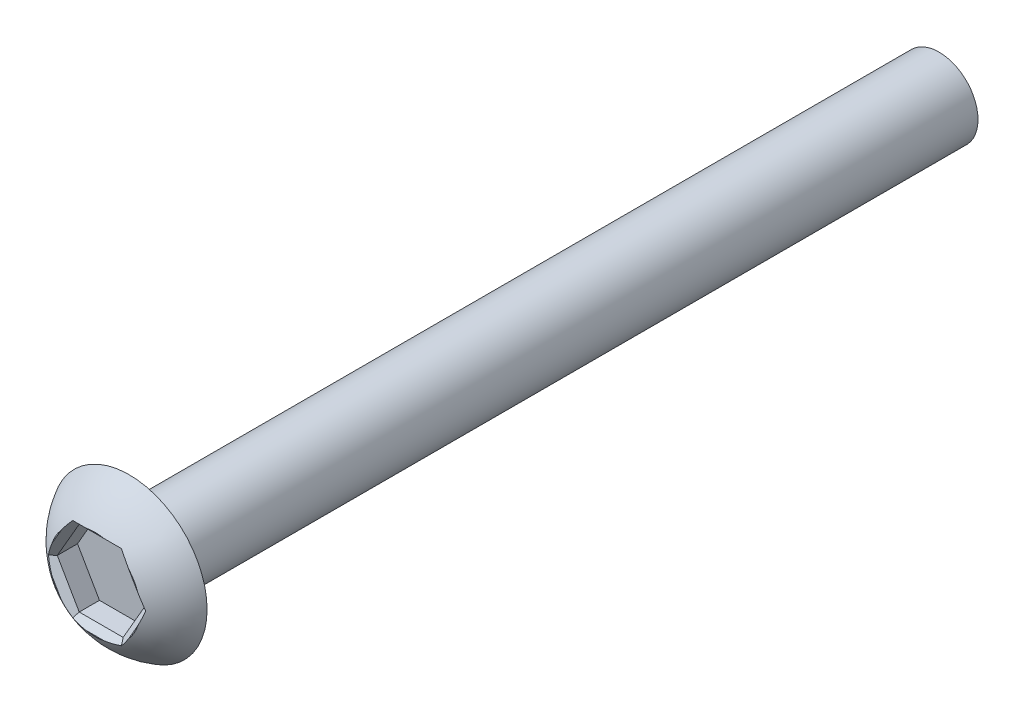
ISO-10303-21;
HEADER;
FILE_DESCRIPTION(('STEP AP214'),'2;1');
FILE_NAME('part.step','',(''),(''),'','','');
FILE_SCHEMA(('AUTOMOTIVE_DESIGN { 1 0 10303 214 1 1 1 1 }'));
ENDSEC;
DATA;
#1=APPLICATION_CONTEXT('core data for automotive mechanical design processes');
#2=APPLICATION_PROTOCOL_DEFINITION('international standard','automotive_design',2000,#1);
#3=PRODUCT_CONTEXT('',#1,'mechanical');
#4=PRODUCT('Part','Part','',(#3));
#5=PRODUCT_RELATED_PRODUCT_CATEGORY('part','',(#4));
#6=PRODUCT_DEFINITION_FORMATION('','',#4);
#7=PRODUCT_DEFINITION_CONTEXT('part definition',#1,'design');
#8=PRODUCT_DEFINITION('design','',#6,#7);
#9=PRODUCT_DEFINITION_SHAPE('','',#8);
#10=(LENGTH_UNIT() NAMED_UNIT(*) SI_UNIT(.MILLI.,.METRE.));
#11=(NAMED_UNIT(*) PLANE_ANGLE_UNIT() SI_UNIT($,.RADIAN.));
#12=(NAMED_UNIT(*) SI_UNIT($,.STERADIAN.) SOLID_ANGLE_UNIT());
#13=UNCERTAINTY_MEASURE_WITH_UNIT(LENGTH_MEASURE(1.E-05),#10,'distance_accuracy_value','');
#14=(GEOMETRIC_REPRESENTATION_CONTEXT(3) GLOBAL_UNCERTAINTY_ASSIGNED_CONTEXT((#13)) GLOBAL_UNIT_ASSIGNED_CONTEXT((#10,
#11,#12)) REPRESENTATION_CONTEXT('',''));
#15=CARTESIAN_POINT('',(0.,0.,0.));
#16=DIRECTION('',(0.,0.,1.));
#17=DIRECTION('',(1.,0.,0.));
#18=AXIS2_PLACEMENT_3D('',#15,#16,#17);
#19=CARTESIAN_POINT('',(-2.5,2.39752736076255,1.1));
#20=DIRECTION('',(0.,0.,-1.));
#21=DIRECTION('',(0.,1.,0.));
#22=AXIS2_PLACEMENT_3D('',#19,#20,#21);
#23=PLANE('',#22);
#24=CARTESIAN_POINT('',(0.,0.,1.1));
#25=DIRECTION('',(0.,0.,-1.));
#26=DIRECTION('',(0.,1.,0.));
#27=AXIS2_PLACEMENT_3D('',#24,#25,#26);
#28=CIRCLE('',#27,1.45143607047182);
#29=CARTESIAN_POINT('',(1.378444499704,0.45448589406322,1.1));
#30=VERTEX_POINT('',#29);
#31=CARTESIAN_POINT('',(1.08281857977244,0.966525007418976,1.1));
#32=VERTEX_POINT('',#31);
#33=EDGE_CURVE('E300',#30,#32,#28,.F.);
#34=ORIENTED_EDGE('',*,*,#33,.T.);
#35=DIRECTION('',(0.499999999999995,-0.866025403784442,0.));
#36=VECTOR('',#35,1.);
#37=CARTESIAN_POINT('',(1.58310702606533,0.100000000000001,1.1));
#38=LINE('',#37,#36);
#39=EDGE_CURVE('E218',#32,#30,#38,.T.);
#40=ORIENTED_EDGE('',*,*,#39,.T.);
#41=EDGE_LOOP('',(#34,#40));
#42=FACE_BOUND('',#41,.T.);
#43=ADVANCED_FACE('F45',(#42),#23,.F.);
#44=CARTESIAN_POINT('',(1.08281857977242,-0.966525007419,1.1));
#45=VERTEX_POINT('',#44);
#46=CARTESIAN_POINT('',(1.37844449970401,-0.454485894063208,1.1));
#47=VERTEX_POINT('',#46);
#48=EDGE_CURVE('E307',#45,#47,#28,.F.);
#49=ORIENTED_EDGE('',*,*,#48,.T.);
#50=DIRECTION('',(-0.500000000000001,-0.866025403784438,0.));
#51=VECTOR('',#50,1.);
#52=CARTESIAN_POINT('',(0.878156053411105,-1.32101090148221,1.1));
#53=LINE('',#52,#51);
#54=EDGE_CURVE('E215',#47,#45,#53,.T.);
#55=ORIENTED_EDGE('',*,*,#54,.T.);
#56=EDGE_LOOP('',(#49,#55));
#57=FACE_BOUND('',#56,.T.);
#58=ADVANCED_FACE('F330',(#57),#23,.F.);
#59=CARTESIAN_POINT('',(-0.295625919931594,-1.4210109014822,1.1));
#60=VERTEX_POINT('',#59);
#61=CARTESIAN_POINT('',(0.295625919931584,-1.42101090148221,1.1));
#62=VERTEX_POINT('',#61);
#63=EDGE_CURVE('E316',#60,#62,#28,.F.);
#64=ORIENTED_EDGE('',*,*,#63,.T.);
#65=DIRECTION('',(-1.,0.,0.));
#66=VECTOR('',#65,1.);
#67=CARTESIAN_POINT('',(-0.704950972654223,-1.4210109014822,1.1));
#68=LINE('',#67,#66);
#69=EDGE_CURVE('E212',#62,#60,#68,.T.);
#70=ORIENTED_EDGE('',*,*,#69,.T.);
#71=EDGE_LOOP('',(#64,#70));
#72=FACE_BOUND('',#71,.T.);
#73=ADVANCED_FACE('F343',(#72),#23,.F.);
#74=CARTESIAN_POINT('',(-1.37844449970401,-0.454485894063192,1.1));
#75=VERTEX_POINT('',#74);
#76=CARTESIAN_POINT('',(-1.08281857977243,-0.966525007418998,1.1));
#77=VERTEX_POINT('',#76);
#78=EDGE_CURVE('E310',#75,#77,#28,.F.);
#79=ORIENTED_EDGE('',*,*,#78,.T.);
#80=DIRECTION('',(-0.499999999999995,0.866025403784442,0.));
#81=VECTOR('',#80,1.);
#82=CARTESIAN_POINT('',(-1.58310702606532,-0.0999999999999906,1.1));
#83=LINE('',#82,#81);
#84=EDGE_CURVE('E209',#77,#75,#83,.T.);
#85=ORIENTED_EDGE('',*,*,#84,.T.);
#86=EDGE_LOOP('',(#79,#85));
#87=FACE_BOUND('',#86,.T.);
#88=ADVANCED_FACE('F348',(#87),#23,.F.);
#89=CARTESIAN_POINT('',(0.295625919931603,1.4210109014822,1.1));
#90=VERTEX_POINT('',#89);
#91=CARTESIAN_POINT('',(-0.295625919931574,1.42101090148221,1.1));
#92=VERTEX_POINT('',#91);
#93=EDGE_CURVE('E294',#90,#92,#28,.F.);
#94=ORIENTED_EDGE('',*,*,#93,.T.);
#95=DIRECTION('',(1.,0.,0.));
#96=VECTOR('',#95,1.);
#97=CARTESIAN_POINT('',(0.704950972654233,1.4210109014822,1.1));
#98=LINE('',#97,#96);
#99=EDGE_CURVE('E206',#92,#90,#98,.T.);
#100=ORIENTED_EDGE('',*,*,#99,.T.);
#101=EDGE_LOOP('',(#94,#100));
#102=FACE_BOUND('',#101,.T.);
#103=ADVANCED_FACE('F358',(#102),#23,.F.);
#104=CARTESIAN_POINT('',(0.,0.,-1.33333333333333));
#105=DIRECTION('',(0.,0.,1.));
#106=DIRECTION('',(0.,-1.,0.));
#107=AXIS2_PLACEMENT_3D('',#104,#105,#106);
#108=SPHERICAL_SURFACE('',#107,2.83333333333333);
#109=ORIENTED_EDGE('',*,*,#33,.F.);
#110=CARTESIAN_POINT('',(-0.438348471401963,-0.253080607962781,-0.827172117407764));
#111=DIRECTION('',(-0.612372435695795,-0.353553390593269,0.70710678118655));
#112=DIRECTION('',(0.755928946018455,0.,0.654653670707976));
#113=AXIS2_PLACEMENT_3D('',#110,#111,#112);
#114=CIRCLE('',#113,2.74141923549888);
#115=CARTESIAN_POINT('',(1.56123159166266,0.,1.03105531808848));
#116=VERTEX_POINT('',#115);
#117=EDGE_CURVE('E255',#30,#116,#114,.F.);
#118=ORIENTED_EDGE('',*,*,#117,.T.);
#119=CARTESIAN_POINT('',(-0.438348471401965,0.253080607962786,-0.827172117407759));
#120=DIRECTION('',(-0.612372435695791,0.353553390593273,0.707106781186551));
#121=DIRECTION('',(0.755928946018458,0.,0.654653670707973));
#122=AXIS2_PLACEMENT_3D('',#119,#120,#121);
#123=CIRCLE('',#122,2.74141923549888);
#124=EDGE_CURVE('E252',#116,#47,#123,.F.);
#125=ORIENTED_EDGE('',*,*,#124,.T.);
#126=ORIENTED_EDGE('',*,*,#48,.F.);
#127=CARTESIAN_POINT('',(-0.438348471401965,0.253080607962786,-0.827172117407759));
#128=DIRECTION('',(-0.612372435695791,0.353553390593273,0.707106781186551));
#129=DIRECTION('',(0.755928946018458,0.,0.654653670707973));
#130=AXIS2_PLACEMENT_3D('',#127,#128,#129);
#131=CIRCLE('',#130,2.74141923549888);
#132=CARTESIAN_POINT('',(0.780615795831329,-1.35206621957068,1.03105531808848));
#133=VERTEX_POINT('',#132);
#134=EDGE_CURVE('E249',#45,#133,#131,.F.);
#135=ORIENTED_EDGE('',*,*,#134,.T.);
#136=CARTESIAN_POINT('',(0.,0.506161215925569,-0.827172117407763));
#137=DIRECTION('',(0.,0.707106781186545,0.70710678118655));
#138=DIRECTION('',(0.,-0.70710678118655,0.707106781186545));
#139=AXIS2_PLACEMENT_3D('',#136,#137,#138);
#140=CIRCLE('',#139,2.74141923549888);
#141=EDGE_CURVE('E246',#133,#62,#140,.F.);
#142=ORIENTED_EDGE('',*,*,#141,.T.);
#143=ORIENTED_EDGE('',*,*,#63,.F.);
#144=CARTESIAN_POINT('',(0.,0.506161215925569,-0.827172117407763));
#145=DIRECTION('',(0.,0.707106781186545,0.70710678118655));
#146=DIRECTION('',(0.,-0.70710678118655,0.707106781186545));
#147=AXIS2_PLACEMENT_3D('',#144,#145,#146);
#148=CIRCLE('',#147,2.74141923549888);
#149=CARTESIAN_POINT('',(-0.780615795831338,-1.35206621957068,1.03105531808848));
#150=VERTEX_POINT('',#149);
#151=EDGE_CURVE('E243',#60,#150,#148,.F.);
#152=ORIENTED_EDGE('',*,*,#151,.T.);
#153=CARTESIAN_POINT('',(0.438348471401965,0.253080607962782,-0.827172117407763));
#154=DIRECTION('',(0.612372435695795,0.353553390593269,0.707106781186549));
#155=DIRECTION('',(0.755928946018455,0.,-0.654653670707977));
#156=AXIS2_PLACEMENT_3D('',#153,#154,#155);
#157=CIRCLE('',#156,2.74141923549888);
#158=EDGE_CURVE('E240',#150,#77,#157,.F.);
#159=ORIENTED_EDGE('',*,*,#158,.T.);
#160=ORIENTED_EDGE('',*,*,#78,.F.);
#161=CARTESIAN_POINT('',(0.438348471401965,0.253080607962782,-0.827172117407763));
#162=DIRECTION('',(0.612372435695795,0.353553390593269,0.707106781186549));
#163=DIRECTION('',(0.755928946018455,0.,-0.654653670707977));
#164=AXIS2_PLACEMENT_3D('',#161,#162,#163);
#165=CIRCLE('',#164,2.74141923549888);
#166=CARTESIAN_POINT('',(-1.56123159166266,0.,1.03105531808848));
#167=VERTEX_POINT('',#166);
#168=EDGE_CURVE('E225',#75,#167,#165,.F.);
#169=ORIENTED_EDGE('',*,*,#168,.T.);
#170=CARTESIAN_POINT('',(0.438348471401962,-0.253080607962788,-0.827172117407761));
#171=DIRECTION('',(0.61237243569579,-0.353553390593277,0.70710678118655));
#172=DIRECTION('',(0.755928946018458,0.,-0.654653670707973));
#173=AXIS2_PLACEMENT_3D('',#170,#171,#172);
#174=CIRCLE('',#173,2.74141923549888);
#175=CARTESIAN_POINT('',(-1.37844449970401,0.454485894063214,1.1));
#176=VERTEX_POINT('',#175);
#177=EDGE_CURVE('E222',#167,#176,#174,.F.);
#178=ORIENTED_EDGE('',*,*,#177,.T.);
#179=CARTESIAN_POINT('',(-1.08281857977241,0.966525007419011,1.1));
#180=VERTEX_POINT('',#179);
#181=EDGE_CURVE('E178',#180,#176,#28,.F.);
#182=ORIENTED_EDGE('',*,*,#181,.F.);
#183=CARTESIAN_POINT('',(0.438348471401962,-0.253080607962788,-0.827172117407761));
#184=DIRECTION('',(0.61237243569579,-0.353553390593277,0.70710678118655));
#185=DIRECTION('',(0.755928946018458,0.,-0.654653670707973));
#186=AXIS2_PLACEMENT_3D('',#183,#184,#185);
#187=CIRCLE('',#186,2.74141923549888);
#188=CARTESIAN_POINT('',(-0.78061579583132,1.35206621957069,1.03105531808848));
#189=VERTEX_POINT('',#188);
#190=EDGE_CURVE('E228',#180,#189,#187,.F.);
#191=ORIENTED_EDGE('',*,*,#190,.T.);
#192=CARTESIAN_POINT('',(0.,-0.506161215925569,-0.827172117407762));
#193=DIRECTION('',(0.,-0.707106781186545,0.707106781186549));
#194=DIRECTION('',(0.,-0.70710678118655,-0.707106781186546));
#195=AXIS2_PLACEMENT_3D('',#192,#193,#194);
#196=CIRCLE('',#195,2.74141923549888);
#197=EDGE_CURVE('E231',#189,#92,#196,.F.);
#198=ORIENTED_EDGE('',*,*,#197,.T.);
#199=ORIENTED_EDGE('',*,*,#93,.F.);
#200=CARTESIAN_POINT('',(0.,-0.506161215925569,-0.827172117407762));
#201=DIRECTION('',(0.,-0.707106781186545,0.707106781186549));
#202=DIRECTION('',(0.,-0.70710678118655,-0.707106781186546));
#203=AXIS2_PLACEMENT_3D('',#200,#201,#202);
#204=CIRCLE('',#203,2.74141923549888);
#205=CARTESIAN_POINT('',(0.780615795831348,1.35206621957067,1.03105531808848));
#206=VERTEX_POINT('',#205);
#207=EDGE_CURVE('E234',#90,#206,#204,.F.);
#208=ORIENTED_EDGE('',*,*,#207,.T.);
#209=CARTESIAN_POINT('',(-0.438348471401963,-0.253080607962781,-0.827172117407764));
#210=DIRECTION('',(-0.612372435695795,-0.353553390593269,0.70710678118655));
#211=DIRECTION('',(0.755928946018455,0.,0.654653670707976));
#212=AXIS2_PLACEMENT_3D('',#209,#210,#211);
#213=CIRCLE('',#212,2.74141923549888);
#214=EDGE_CURVE('E237',#206,#32,#213,.F.);
#215=ORIENTED_EDGE('',*,*,#214,.T.);
#216=EDGE_LOOP('',(#109,#118,#125,#126,#135,#142,#143,#152,#159,#160,#169,#178,#182,#191,#198,
#199,#208,#215));
#217=FACE_BOUND('',#216,.T.);
#218=CARTESIAN_POINT('',(0.,0.,0.));
#219=DIRECTION('',(0.,0.,1.));
#220=DIRECTION('',(1.,0.,0.));
#221=AXIS2_PLACEMENT_3D('',#218,#219,#220);
#222=CIRCLE('',#221,2.5);
#223=CARTESIAN_POINT('',(2.5,0.,0.));
#224=VERTEX_POINT('',#223);
#225=EDGE_CURVE('E184',#224,#224,#222,.T.);
#226=ORIENTED_EDGE('',*,*,#225,.T.);
#227=EDGE_LOOP('',(#226));
#228=FACE_BOUND('',#227,.T.);
#229=ADVANCED_FACE('F340',(#217,#228),#108,.T.);
#230=CARTESIAN_POINT('',(0.,0.,-26.));
#231=DIRECTION('',(0.,0.,1.));
#232=DIRECTION('',(1.,0.,0.));
#233=AXIS2_PLACEMENT_3D('',#230,#231,#232);
#234=CYLINDRICAL_SURFACE('',#233,1.25);
#235=CARTESIAN_POINT('',(0.,0.,-26.));
#236=DIRECTION('',(0.,0.,1.));
#237=DIRECTION('',(1.,0.,0.));
#238=AXIS2_PLACEMENT_3D('',#235,#236,#237);
#239=CIRCLE('',#238,1.25);
#240=CARTESIAN_POINT('',(1.25,0.,-26.));
#241=VERTEX_POINT('',#240);
#242=EDGE_CURVE('E196',#241,#241,#239,.T.);
#243=CARTESIAN_POINT('',(0.,0.,0.));
#244=DIRECTION('',(0.,0.,1.));
#245=DIRECTION('',(1.,0.,0.));
#246=AXIS2_PLACEMENT_3D('',#243,#244,#245);
#247=CIRCLE('',#246,1.25);
#248=CARTESIAN_POINT('',(1.25,0.,0.));
#249=VERTEX_POINT('',#248);
#250=EDGE_CURVE('E190',#249,#249,#247,.T.);
#251=CARTESIAN_POINT('',(1.25,0.,-26.));
#252=CARTESIAN_POINT('',(1.25,0.,-25.7291666666667));
#253=CARTESIAN_POINT('',(1.25,0.,-25.4583333333333));
#254=CARTESIAN_POINT('',(1.25,0.,-24.9166666666667));
#255=CARTESIAN_POINT('',(1.25,0.,-24.6458333333333));
#256=CARTESIAN_POINT('',(1.25,0.,-24.1041666666667));
#257=CARTESIAN_POINT('',(1.25,0.,-23.8333333333333));
#258=CARTESIAN_POINT('',(1.25,0.,-23.2916666666667));
#259=CARTESIAN_POINT('',(1.25,0.,-23.0208333333333));
#260=CARTESIAN_POINT('',(1.25,0.,-22.4791666666667));
#261=CARTESIAN_POINT('',(1.25,0.,-22.2083333333333));
#262=CARTESIAN_POINT('',(1.25,0.,-21.6666666666667));
#263=CARTESIAN_POINT('',(1.25,0.,-21.3958333333333));
#264=CARTESIAN_POINT('',(1.25,0.,-20.8541666666667));
#265=CARTESIAN_POINT('',(1.25,0.,-20.5833333333333));
#266=CARTESIAN_POINT('',(1.25,0.,-20.0416666666667));
#267=CARTESIAN_POINT('',(1.25,0.,-19.7708333333333));
#268=CARTESIAN_POINT('',(1.25,0.,-19.2291666666667));
#269=CARTESIAN_POINT('',(1.25,0.,-18.9583333333333));
#270=CARTESIAN_POINT('',(1.25,0.,-18.4166666666667));
#271=CARTESIAN_POINT('',(1.25,0.,-18.1458333333333));
#272=CARTESIAN_POINT('',(1.25,0.,-17.6041666666667));
#273=CARTESIAN_POINT('',(1.25,0.,-17.3333333333333));
#274=CARTESIAN_POINT('',(1.25,0.,-16.7916666666667));
#275=CARTESIAN_POINT('',(1.25,0.,-16.5208333333333));
#276=CARTESIAN_POINT('',(1.25,0.,-15.9791666666667));
#277=CARTESIAN_POINT('',(1.25,0.,-15.7083333333333));
#278=CARTESIAN_POINT('',(1.25,0.,-15.1666666666667));
#279=CARTESIAN_POINT('',(1.25,0.,-14.8958333333333));
#280=CARTESIAN_POINT('',(1.25,0.,-14.3541666666667));
#281=CARTESIAN_POINT('',(1.25,0.,-14.0833333333333));
#282=CARTESIAN_POINT('',(1.25,0.,-13.5416666666667));
#283=CARTESIAN_POINT('',(1.25,0.,-13.2708333333333));
#284=CARTESIAN_POINT('',(1.25,0.,-12.7291666666667));
#285=CARTESIAN_POINT('',(1.25,0.,-12.4583333333333));
#286=CARTESIAN_POINT('',(1.25,0.,-11.9166666666667));
#287=CARTESIAN_POINT('',(1.25,0.,-11.6458333333333));
#288=CARTESIAN_POINT('',(1.25,0.,-11.1041666666667));
#289=CARTESIAN_POINT('',(1.25,0.,-10.8333333333333));
#290=CARTESIAN_POINT('',(1.25,0.,-10.2916666666667));
#291=CARTESIAN_POINT('',(1.25,0.,-10.0208333333333));
#292=CARTESIAN_POINT('',(1.25,0.,-9.47916666666667));
#293=CARTESIAN_POINT('',(1.25,0.,-9.20833333333333));
#294=CARTESIAN_POINT('',(1.25,0.,-8.66666666666667));
#295=CARTESIAN_POINT('',(1.25,0.,-8.39583333333333));
#296=CARTESIAN_POINT('',(1.25,0.,-7.85416666666667));
#297=CARTESIAN_POINT('',(1.25,0.,-7.58333333333333));
#298=CARTESIAN_POINT('',(1.25,0.,-7.04166666666667));
#299=CARTESIAN_POINT('',(1.25,0.,-6.77083333333333));
#300=CARTESIAN_POINT('',(1.25,0.,-6.22916666666667));
#301=CARTESIAN_POINT('',(1.25,0.,-5.95833333333333));
#302=CARTESIAN_POINT('',(1.25,0.,-5.41666666666667));
#303=CARTESIAN_POINT('',(1.25,0.,-5.14583333333333));
#304=CARTESIAN_POINT('',(1.25,0.,-4.60416666666667));
#305=CARTESIAN_POINT('',(1.25,0.,-4.33333333333333));
#306=CARTESIAN_POINT('',(1.25,0.,-3.79166666666667));
#307=CARTESIAN_POINT('',(1.25,0.,-3.52083333333333));
#308=CARTESIAN_POINT('',(1.25,0.,-2.97916666666667));
#309=CARTESIAN_POINT('',(1.25,0.,-2.70833333333333));
#310=CARTESIAN_POINT('',(1.25,0.,-2.16666666666667));
#311=CARTESIAN_POINT('',(1.25,0.,-1.89583333333333));
#312=CARTESIAN_POINT('',(1.25,0.,-1.35416666666667));
#313=CARTESIAN_POINT('',(1.25,0.,-1.08333333333333));
#314=CARTESIAN_POINT('',(1.25,0.,-0.541666666666667));
#315=CARTESIAN_POINT('',(1.25,0.,-0.270833333333334));
#316=CARTESIAN_POINT('',(1.25,0.,0.));
#317=B_SPLINE_CURVE_WITH_KNOTS('',3,(#251,#252,#253,#254,#255,#256,#257,#258,#259,#260,#261,
#262,#263,#264,#265,#266,#267,#268,#269,#270,#271,#272,#273,#274,#275,#276,#277,#278,#279,#280,
#281,#282,#283,#284,#285,#286,#287,#288,#289,#290,#291,#292,#293,#294,#295,#296,#297,#298,#299,
#300,#301,#302,#303,#304,#305,#306,#307,#308,#309,#310,#311,#312,#313,#314,#315,#316),
.UNSPECIFIED.,.F.,.F.,(4,2,2,2,2,2,2,2,2,2,2,2,2,2,2,2,2,2,2,2,2,2,2,2,2,2,2,2,2,2,2,2,4),(0.,
0.812499999999997,1.625,2.4375,3.25,4.0625,4.875,5.6875,6.5,7.3125,8.125,8.9375,9.75,10.5625,
11.375,12.1875,13.,13.8125,14.625,15.4375,16.25,17.0625,17.875,18.6875,19.5,20.3125,21.125,
21.9375,22.75,23.5625,24.375,25.1875,26.),.UNSPECIFIED.);
#318=EDGE_CURVE('BSEAM385',#241,#249,#317,.T.);
#319=ORIENTED_EDGE('',*,*,#242,.T.);
#320=ORIENTED_EDGE('',*,*,#250,.F.);
#321=ORIENTED_EDGE('',*,*,#318,.T.);
#322=ORIENTED_EDGE('',*,*,#318,.F.);
#323=EDGE_LOOP('',(#319,#321,#320,#322));
#324=FACE_BOUND('',#323,.T.);
#325=ADVANCED_FACE('F385',(#324),#234,.T.);
#326=CARTESIAN_POINT('',(0.,0.,-26.));
#327=DIRECTION('',(0.,0.,1.));
#328=DIRECTION('',(1.,0.,0.));
#329=AXIS2_PLACEMENT_3D('',#326,#327,#328);
#330=PLANE('',#329);
#331=ORIENTED_EDGE('',*,*,#242,.F.);
#332=EDGE_LOOP('',(#331));
#333=FACE_BOUND('',#332,.T.);
#334=ADVANCED_FACE('F377',(#333),#330,.F.);
#335=CARTESIAN_POINT('',(0.,0.,0.));
#336=DIRECTION('',(0.,0.,1.));
#337=DIRECTION('',(1.,0.,0.));
#338=AXIS2_PLACEMENT_3D('',#335,#336,#337);
#339=PLANE('',#338);
#340=ORIENTED_EDGE('',*,*,#250,.T.);
#341=EDGE_LOOP('',(#340));
#342=FACE_BOUND('',#341,.T.);
#343=ORIENTED_EDGE('',*,*,#225,.F.);
#344=EDGE_LOOP('',(#343));
#345=FACE_BOUND('',#344,.T.);
#346=ADVANCED_FACE('F371',(#342,#345),#339,.F.);
#347=ORIENTED_EDGE('',*,*,#181,.T.);
#348=DIRECTION('',(0.500000000000007,0.866025403784435,0.));
#349=VECTOR('',#348,1.);
#350=CARTESIAN_POINT('',(-0.878156053411096,1.32101090148221,1.1));
#351=LINE('',#350,#349);
#352=EDGE_CURVE('E200',#176,#180,#351,.T.);
#353=ORIENTED_EDGE('',*,*,#352,.T.);
#354=EDGE_LOOP('',(#347,#353));
#355=FACE_BOUND('',#354,.T.);
#356=ADVANCED_FACE('F352',(#355),#23,.F.);
#357=CARTESIAN_POINT('',(0.,0.,0.25));
#358=DIRECTION('',(0.,0.,-1.));
#359=DIRECTION('',(-1.,0.,0.));
#360=AXIS2_PLACEMENT_3D('',#357,#358,#359);
#361=PLANE('',#360);
#362=DIRECTION('',(0.499999999999995,-0.866025403784441,0.));
#363=VECTOR('',#362,1.);
#364=CARTESIAN_POINT('',(0.704950972654231,1.22101090148219,0.25));
#365=LINE('',#364,#363);
#366=CARTESIAN_POINT('',(0.704950972654231,1.22101090148219,0.25));
#367=VERTEX_POINT('',#366);
#368=CARTESIAN_POINT('',(1.40990194530843,0.,0.25));
#369=VERTEX_POINT('',#368);
#370=EDGE_CURVE('E160',#367,#369,#365,.T.);
#371=ORIENTED_EDGE('',*,*,#370,.F.);
#372=DIRECTION('',(1.,0.,0.));
#373=VECTOR('',#372,1.);
#374=CARTESIAN_POINT('',(-0.704950972654205,1.22101090148221,0.25));
#375=LINE('',#374,#373);
#376=CARTESIAN_POINT('',(-0.704950972654205,1.22101090148221,0.25));
#377=VERTEX_POINT('',#376);
#378=EDGE_CURVE('E574',#377,#367,#375,.T.);
#379=ORIENTED_EDGE('',*,*,#378,.F.);
#380=DIRECTION('',(0.500000000000007,0.866025403784434,0.));
#381=VECTOR('',#380,1.);
#382=CARTESIAN_POINT('',(-1.40990194530843,0.,0.25));
#383=LINE('',#382,#381);
#384=CARTESIAN_POINT('',(-1.40990194530843,0.,0.25));
#385=VERTEX_POINT('',#384);
#386=EDGE_CURVE('E577',#385,#377,#383,.T.);
#387=ORIENTED_EDGE('',*,*,#386,.F.);
#388=DIRECTION('',(-0.499999999999995,0.866025403784442,0.));
#389=VECTOR('',#388,1.);
#390=CARTESIAN_POINT('',(-0.704950972654223,-1.2210109014822,0.25));
#391=LINE('',#390,#389);
#392=CARTESIAN_POINT('',(-0.704950972654223,-1.2210109014822,0.25));
#393=VERTEX_POINT('',#392);
#394=EDGE_CURVE('E580',#393,#385,#391,.T.);
#395=ORIENTED_EDGE('',*,*,#394,.F.);
#396=DIRECTION('',(-1.,0.,0.));
#397=VECTOR('',#396,1.);
#398=CARTESIAN_POINT('',(0.704950972654214,-1.2210109014822,0.25));
#399=LINE('',#398,#397);
#400=CARTESIAN_POINT('',(0.704950972654214,-1.2210109014822,0.25));
#401=VERTEX_POINT('',#400);
#402=EDGE_CURVE('E162',#401,#393,#399,.T.);
#403=ORIENTED_EDGE('',*,*,#402,.F.);
#404=DIRECTION('',(-0.500000000000001,-0.866025403784438,0.));
#405=VECTOR('',#404,1.);
#406=CARTESIAN_POINT('',(1.40990194530843,0.,0.25));
#407=LINE('',#406,#405);
#408=EDGE_CURVE('E156',#369,#401,#407,.T.);
#409=ORIENTED_EDGE('',*,*,#408,.F.);
#410=EDGE_LOOP('',(#371,#379,#387,#395,#403,#409));
#411=FACE_BOUND('',#410,.T.);
#412=ADVANCED_FACE('F158',(#411),#361,.F.);
#413=CARTESIAN_POINT('',(-0.704950972654205,1.22101090148221,0.25));
#414=DIRECTION('',(0.,-1.,0.));
#415=DIRECTION('',(1.,0.,0.));
#416=AXIS2_PLACEMENT_3D('',#413,#414,#415);
#417=PLANE('',#416);
#418=DIRECTION('',(0.,0.,1.));
#419=VECTOR('',#418,1.);
#420=CARTESIAN_POINT('',(0.704950972654231,1.22101090148219,0.25));
#421=LINE('',#420,#419);
#422=CARTESIAN_POINT('',(0.704950972654231,1.22101090148219,0.899999999999998));
#423=VERTEX_POINT('',#422);
#424=EDGE_CURVE('E176',#367,#423,#421,.T.);
#425=ORIENTED_EDGE('',*,*,#424,.T.);
#426=DIRECTION('',(-1.,0.,0.));
#427=VECTOR('',#426,1.);
#428=CARTESIAN_POINT('',(-0.704950972654205,1.22101090148221,0.899999999999998));
#429=LINE('',#428,#427);
#430=CARTESIAN_POINT('',(-0.704950972654205,1.22101090148221,0.899999999999998));
#431=VERTEX_POINT('',#430);
#432=EDGE_CURVE('E56',#423,#431,#429,.T.);
#433=ORIENTED_EDGE('',*,*,#432,.T.);
#434=DIRECTION('',(0.,0.,1.));
#435=VECTOR('',#434,1.);
#436=CARTESIAN_POINT('',(-0.704950972654205,1.22101090148221,0.25));
#437=LINE('',#436,#435);
#438=EDGE_CURVE('E567',#377,#431,#437,.T.);
#439=ORIENTED_EDGE('',*,*,#438,.F.);
#440=ORIENTED_EDGE('',*,*,#378,.T.);
#441=EDGE_LOOP('',(#425,#433,#439,#440));
#442=FACE_BOUND('',#441,.T.);
#443=ADVANCED_FACE('F376',(#442),#417,.T.);
#444=CARTESIAN_POINT('',(-1.40990194530843,0.,0.25));
#445=DIRECTION('',(0.866025403784435,-0.500000000000007,0.));
#446=DIRECTION('',(0.500000000000007,0.866025403784435,0.));
#447=AXIS2_PLACEMENT_3D('',#444,#445,#446);
#448=PLANE('',#447);
#449=ORIENTED_EDGE('',*,*,#438,.T.);
#450=DIRECTION('',(-0.500000000000007,-0.866025403784435,0.));
#451=VECTOR('',#450,1.);
#452=CARTESIAN_POINT('',(-1.40990194530843,0.,0.899999999999998));
#453=LINE('',#452,#451);
#454=CARTESIAN_POINT('',(-1.40990194530843,0.,0.899999999999998));
#455=VERTEX_POINT('',#454);
#456=EDGE_CURVE('E11',#431,#455,#453,.T.);
#457=ORIENTED_EDGE('',*,*,#456,.T.);
#458=DIRECTION('',(0.,0.,1.));
#459=VECTOR('',#458,1.);
#460=CARTESIAN_POINT('',(-1.40990194530843,0.,0.25));
#461=LINE('',#460,#459);
#462=EDGE_CURVE('E565',#385,#455,#461,.T.);
#463=ORIENTED_EDGE('',*,*,#462,.F.);
#464=ORIENTED_EDGE('',*,*,#386,.T.);
#465=EDGE_LOOP('',(#449,#457,#463,#464));
#466=FACE_BOUND('',#465,.T.);
#467=ADVANCED_FACE('F453',(#466),#448,.T.);
#468=CARTESIAN_POINT('',(-0.704950972654223,-1.2210109014822,0.25));
#469=DIRECTION('',(0.866025403784442,0.499999999999995,0.));
#470=DIRECTION('',(-0.499999999999995,0.866025403784442,0.));
#471=AXIS2_PLACEMENT_3D('',#468,#469,#470);
#472=PLANE('',#471);
#473=ORIENTED_EDGE('',*,*,#462,.T.);
#474=DIRECTION('',(0.499999999999995,-0.866025403784442,0.));
#475=VECTOR('',#474,1.);
#476=CARTESIAN_POINT('',(-0.704950972654223,-1.2210109014822,0.899999999999998));
#477=LINE('',#476,#475);
#478=CARTESIAN_POINT('',(-0.704950972654223,-1.2210109014822,0.899999999999998));
#479=VERTEX_POINT('',#478);
#480=EDGE_CURVE('E266',#455,#479,#477,.T.);
#481=ORIENTED_EDGE('',*,*,#480,.T.);
#482=DIRECTION('',(0.,0.,1.));
#483=VECTOR('',#482,1.);
#484=CARTESIAN_POINT('',(-0.704950972654223,-1.2210109014822,0.25));
#485=LINE('',#484,#483);
#486=EDGE_CURVE('E192',#393,#479,#485,.T.);
#487=ORIENTED_EDGE('',*,*,#486,.F.);
#488=ORIENTED_EDGE('',*,*,#394,.T.);
#489=EDGE_LOOP('',(#473,#481,#487,#488));
#490=FACE_BOUND('',#489,.T.);
#491=ADVANCED_FACE('F462',(#490),#472,.T.);
#492=CARTESIAN_POINT('',(0.704950972654214,-1.2210109014822,0.25));
#493=DIRECTION('',(0.,1.,0.));
#494=DIRECTION('',(-1.,0.,0.));
#495=AXIS2_PLACEMENT_3D('',#492,#493,#494);
#496=PLANE('',#495);
#497=ORIENTED_EDGE('',*,*,#486,.T.);
#498=DIRECTION('',(1.,0.,0.));
#499=VECTOR('',#498,1.);
#500=CARTESIAN_POINT('',(0.704950972654214,-1.2210109014822,0.899999999999998));
#501=LINE('',#500,#499);
#502=CARTESIAN_POINT('',(0.704950972654214,-1.2210109014822,0.899999999999998));
#503=VERTEX_POINT('',#502);
#504=EDGE_CURVE('E263',#479,#503,#501,.T.);
#505=ORIENTED_EDGE('',*,*,#504,.T.);
#506=DIRECTION('',(0.,0.,1.));
#507=VECTOR('',#506,1.);
#508=CARTESIAN_POINT('',(0.704950972654214,-1.2210109014822,0.25));
#509=LINE('',#508,#507);
#510=EDGE_CURVE('E185',#401,#503,#509,.T.);
#511=ORIENTED_EDGE('',*,*,#510,.F.);
#512=ORIENTED_EDGE('',*,*,#402,.T.);
#513=EDGE_LOOP('',(#497,#505,#511,#512));
#514=FACE_BOUND('',#513,.T.);
#515=ADVANCED_FACE('F471',(#514),#496,.T.);
#516=CARTESIAN_POINT('',(1.40990194530843,0.,0.25));
#517=DIRECTION('',(-0.866025403784438,0.500000000000001,0.));
#518=DIRECTION('',(-0.500000000000001,-0.866025403784438,0.));
#519=AXIS2_PLACEMENT_3D('',#516,#517,#518);
#520=PLANE('',#519);
#521=ORIENTED_EDGE('',*,*,#510,.T.);
#522=DIRECTION('',(0.500000000000001,0.866025403784438,0.));
#523=VECTOR('',#522,1.);
#524=CARTESIAN_POINT('',(1.40990194530843,0.,0.899999999999998));
#525=LINE('',#524,#523);
#526=CARTESIAN_POINT('',(1.40990194530843,0.,0.899999999999998));
#527=VERTEX_POINT('',#526);
#528=EDGE_CURVE('E182',#503,#527,#525,.T.);
#529=ORIENTED_EDGE('',*,*,#528,.T.);
#530=DIRECTION('',(0.,0.,1.));
#531=VECTOR('',#530,1.);
#532=CARTESIAN_POINT('',(1.40990194530843,0.,0.25));
#533=LINE('',#532,#531);
#534=EDGE_CURVE('E174',#369,#527,#533,.T.);
#535=ORIENTED_EDGE('',*,*,#534,.F.);
#536=ORIENTED_EDGE('',*,*,#408,.T.);
#537=EDGE_LOOP('',(#521,#529,#535,#536));
#538=FACE_BOUND('',#537,.T.);
#539=ADVANCED_FACE('F180',(#538),#520,.T.);
#540=CARTESIAN_POINT('',(0.704950972654231,1.22101090148219,0.25));
#541=DIRECTION('',(-0.866025403784442,-0.499999999999995,0.));
#542=DIRECTION('',(0.499999999999995,-0.866025403784442,0.));
#543=AXIS2_PLACEMENT_3D('',#540,#541,#542);
#544=PLANE('',#543);
#545=ORIENTED_EDGE('',*,*,#534,.T.);
#546=DIRECTION('',(-0.499999999999995,0.866025403784442,0.));
#547=VECTOR('',#546,1.);
#548=CARTESIAN_POINT('',(0.704950972654231,1.22101090148219,0.899999999999998));
#549=LINE('',#548,#547);
#550=EDGE_CURVE('E258',#527,#423,#549,.T.);
#551=ORIENTED_EDGE('',*,*,#550,.T.);
#552=ORIENTED_EDGE('',*,*,#424,.F.);
#553=ORIENTED_EDGE('',*,*,#370,.T.);
#554=EDGE_LOOP('',(#545,#551,#552,#553));
#555=FACE_BOUND('',#554,.T.);
#556=ADVANCED_FACE('F172',(#555),#544,.T.);
#557=CARTESIAN_POINT('',(-2.89379134008251,2.17017182456137,1.1));
#558=DIRECTION('',(0.612372435695795,0.353553390593269,0.707106781186549));
#559=DIRECTION('',(0.499999999999995,-0.866025403784442,0.));
#560=AXIS2_PLACEMENT_3D('',#557,#558,#559);
#561=PLANE('',#560);
#562=DIRECTION('',(-0.377964473009231,-0.654653670707977,0.654653670707975));
#563=VECTOR('',#562,1.);
#564=CARTESIAN_POINT('',(-0.228029508323459,-0.394958694041179,0.0739477925589802));
#565=LINE('',#564,#563);
#566=EDGE_CURVE('E285',#479,#150,#565,.T.);
#567=ORIENTED_EDGE('',*,*,#566,.F.);
#568=ORIENTED_EDGE('',*,*,#480,.F.);
#569=DIRECTION('',(-0.755928946018457,0.,0.654653670707975));
#570=VECTOR('',#569,1.);
#571=CARTESIAN_POINT('',(-1.17034473093264,0.,0.692537366690731));
#572=LINE('',#571,#570);
#573=EDGE_CURVE('E50',#167,#455,#572,.F.);
#574=ORIENTED_EDGE('',*,*,#573,.F.);
#575=ORIENTED_EDGE('',*,*,#168,.F.);
#576=ORIENTED_EDGE('',*,*,#84,.F.);
#577=ORIENTED_EDGE('',*,*,#158,.F.);
#578=EDGE_LOOP('',(#567,#568,#574,#575,#576,#577));
#579=FACE_BOUND('',#578,.T.);
#580=ADVANCED_FACE('F48',(#579),#561,.T.);
#581=CARTESIAN_POINT('',(-0.817471739393903,1.42611921658245,1.1));
#582=DIRECTION('',(0.61237243569579,-0.353553390593277,0.70710678118655));
#583=DIRECTION('',(-0.500000000000007,-0.866025403784435,0.));
#584=AXIS2_PLACEMENT_3D('',#581,#582,#583);
#585=PLANE('',#584);
#586=ORIENTED_EDGE('',*,*,#573,.T.);
#587=ORIENTED_EDGE('',*,*,#456,.F.);
#588=DIRECTION('',(0.377964473009223,-0.654653670707982,-0.654653670707974));
#589=VECTOR('',#588,1.);
#590=CARTESIAN_POINT('',(-0.821263679948768,1.42247042008228,1.10145951860007));
#591=LINE('',#590,#589);
#592=EDGE_CURVE('E282',#189,#431,#591,.T.);
#593=ORIENTED_EDGE('',*,*,#592,.F.);
#594=ORIENTED_EDGE('',*,*,#190,.F.);
#595=ORIENTED_EDGE('',*,*,#352,.F.);
#596=ORIENTED_EDGE('',*,*,#177,.F.);
#597=EDGE_LOOP('',(#586,#587,#593,#594,#595,#596));
#598=FACE_BOUND('',#597,.T.);
#599=ADVANCED_FACE('F349',(#598),#585,.T.);
#600=CARTESIAN_POINT('',(-2.50000000000001,-1.4210109014822,1.1));
#601=DIRECTION('',(0.,0.707106781186545,0.70710678118655));
#602=DIRECTION('',(1.,0.,0.));
#603=AXIS2_PLACEMENT_3D('',#600,#601,#602);
#604=PLANE('',#603);
#605=ORIENTED_EDGE('',*,*,#69,.F.);
#606=ORIENTED_EDGE('',*,*,#141,.F.);
#607=DIRECTION('',(0.377964473009229,-0.654653670707979,0.654653670707974));
#608=VECTOR('',#607,1.);
#609=CARTESIAN_POINT('',(0.346075165564683,-0.59941976999585,0.27840886851365));
#610=LINE('',#609,#608);
#611=EDGE_CURVE('E278',#503,#133,#610,.T.);
#612=ORIENTED_EDGE('',*,*,#611,.F.);
#613=ORIENTED_EDGE('',*,*,#504,.F.);
#614=ORIENTED_EDGE('',*,*,#566,.T.);
#615=ORIENTED_EDGE('',*,*,#151,.F.);
#616=EDGE_LOOP('',(#605,#606,#612,#613,#614,#615));
#617=FACE_BOUND('',#616,.T.);
#618=ADVANCED_FACE('F342',(#617),#604,.T.);
#619=CARTESIAN_POINT('',(-2.50000000000001,1.42101090148223,1.1));
#620=DIRECTION('',(0.,-0.707106781186545,0.707106781186549));
#621=DIRECTION('',(-1.,0.,0.));
#622=AXIS2_PLACEMENT_3D('',#619,#620,#621);
#623=PLANE('',#622);
#624=ORIENTED_EDGE('',*,*,#592,.T.);
#625=ORIENTED_EDGE('',*,*,#432,.F.);
#626=DIRECTION('',(-0.377964473009233,-0.654653670707975,-0.654653670707975));
#627=VECTOR('',#626,1.);
#628=CARTESIAN_POINT('',(0.3460751655647,0.599419769995851,0.278408868513654));
#629=LINE('',#628,#627);
#630=EDGE_CURVE('E275',#206,#423,#629,.T.);
#631=ORIENTED_EDGE('',*,*,#630,.F.);
#632=ORIENTED_EDGE('',*,*,#207,.F.);
#633=ORIENTED_EDGE('',*,*,#99,.F.);
#634=ORIENTED_EDGE('',*,*,#197,.F.);
#635=EDGE_LOOP('',(#624,#625,#631,#632,#633,#634));
#636=FACE_BOUND('',#635,.T.);
#637=ADVANCED_FACE('F355',(#636),#623,.T.);
#638=CARTESIAN_POINT('',(1.64379134008253,0.00510831510025858,1.1));
#639=DIRECTION('',(-0.612372435695791,0.353553390593273,0.707106781186551));
#640=DIRECTION('',(0.500000000000001,0.866025403784438,0.));
#641=AXIS2_PLACEMENT_3D('',#638,#639,#640);
#642=PLANE('',#641);
#643=ORIENTED_EDGE('',*,*,#54,.F.);
#644=ORIENTED_EDGE('',*,*,#124,.F.);
#645=DIRECTION('',(0.755928946018457,0.,0.654653670707975));
#646=VECTOR('',#645,1.);
#647=CARTESIAN_POINT('',(1.64252735989757,0.,1.10145951860007));
#648=LINE('',#647,#646);
#649=EDGE_CURVE('E271',#527,#116,#648,.T.);
#650=ORIENTED_EDGE('',*,*,#649,.F.);
#651=ORIENTED_EDGE('',*,*,#528,.F.);
#652=ORIENTED_EDGE('',*,*,#611,.T.);
#653=ORIENTED_EDGE('',*,*,#134,.F.);
#654=EDGE_LOOP('',(#643,#644,#650,#651,#652,#653));
#655=FACE_BOUND('',#654,.T.);
#656=ADVANCED_FACE('F335',(#655),#642,.T.);
#657=CARTESIAN_POINT('',(-0.432528260606071,3.59118272604357,1.1));
#658=DIRECTION('',(-0.612372435695795,-0.353553390593269,0.70710678118655));
#659=DIRECTION('',(-0.499999999999995,0.866025403784442,0.));
#660=AXIS2_PLACEMENT_3D('',#657,#658,#659);
#661=PLANE('',#660);
#662=ORIENTED_EDGE('',*,*,#630,.T.);
#663=ORIENTED_EDGE('',*,*,#550,.F.);
#664=ORIENTED_EDGE('',*,*,#649,.T.);
#665=ORIENTED_EDGE('',*,*,#117,.F.);
#666=ORIENTED_EDGE('',*,*,#39,.F.);
#667=ORIENTED_EDGE('',*,*,#214,.F.);
#668=EDGE_LOOP('',(#662,#663,#664,#665,#666,#667));
#669=FACE_BOUND('',#668,.T.);
#670=ADVANCED_FACE('F362',(#669),#661,.T.);
#671=CLOSED_SHELL('',(#43,#58,#73,#88,#103,#229,#325,#334,#346,#356,#412,#443,#467,#491,#515,
#539,#556,#580,#599,#618,#637,#656,#670));
#672=MANIFOLD_SOLID_BREP('B2',#671);
#673=ADVANCED_BREP_SHAPE_REPRESENTATION('',(#18,#672),#14);
#674=SHAPE_DEFINITION_REPRESENTATION(#9,#673);
ENDSEC;
END-ISO-10303-21;
